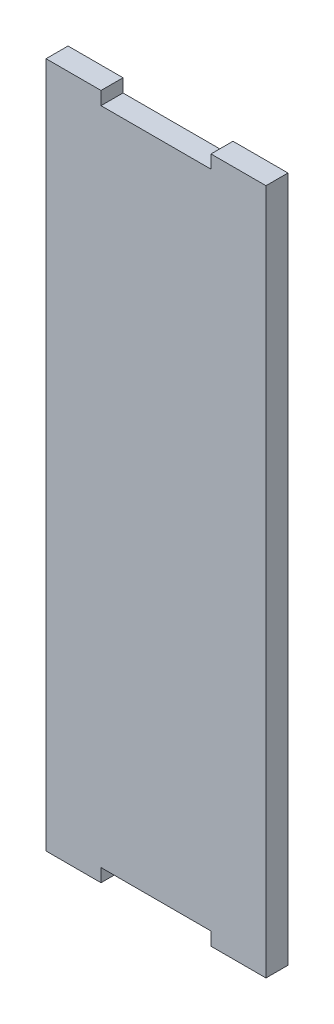
ISO-10303-21;
HEADER;
FILE_DESCRIPTION(('STEP AP214'),'2;1');
FILE_NAME('part.step','',(''),(''),'','','');
FILE_SCHEMA(('AUTOMOTIVE_DESIGN { 1 0 10303 214 1 1 1 1 }'));
ENDSEC;
DATA;
#1=APPLICATION_CONTEXT('core data for automotive mechanical design processes');
#2=APPLICATION_PROTOCOL_DEFINITION('international standard','automotive_design',2000,#1);
#3=PRODUCT_CONTEXT('',#1,'mechanical');
#4=PRODUCT('Part','Part','',(#3));
#5=PRODUCT_RELATED_PRODUCT_CATEGORY('part','',(#4));
#6=PRODUCT_DEFINITION_FORMATION('','',#4);
#7=PRODUCT_DEFINITION_CONTEXT('part definition',#1,'design');
#8=PRODUCT_DEFINITION('design','',#6,#7);
#9=PRODUCT_DEFINITION_SHAPE('','',#8);
#10=(LENGTH_UNIT() NAMED_UNIT(*) SI_UNIT(.MILLI.,.METRE.));
#11=(NAMED_UNIT(*) PLANE_ANGLE_UNIT() SI_UNIT($,.RADIAN.));
#12=(NAMED_UNIT(*) SI_UNIT($,.STERADIAN.) SOLID_ANGLE_UNIT());
#13=UNCERTAINTY_MEASURE_WITH_UNIT(LENGTH_MEASURE(1.E-05),#10,'distance_accuracy_value','');
#14=(GEOMETRIC_REPRESENTATION_CONTEXT(3) GLOBAL_UNCERTAINTY_ASSIGNED_CONTEXT((#13)) GLOBAL_UNIT_ASSIGNED_CONTEXT((#10,
#11,#12)) REPRESENTATION_CONTEXT('',''));
#15=CARTESIAN_POINT('',(0.,0.,0.));
#16=DIRECTION('',(0.,0.,1.));
#17=DIRECTION('',(1.,0.,0.));
#18=AXIS2_PLACEMENT_3D('',#15,#16,#17);
#19=CARTESIAN_POINT('',(-25.,78.,5.));
#20=DIRECTION('',(0.,-1.,0.));
#21=DIRECTION('',(0.,0.,-1.));
#22=AXIS2_PLACEMENT_3D('',#19,#20,#21);
#23=PLANE('',#22);
#24=DIRECTION('',(0.,0.,-1.));
#25=VECTOR('',#24,1.);
#26=CARTESIAN_POINT('',(12.5,78.,27.86));
#27=LINE('',#26,#25);
#28=CARTESIAN_POINT('',(12.5,78.,5.));
#29=VERTEX_POINT('',#28);
#30=CARTESIAN_POINT('',(12.5,78.,0.));
#31=VERTEX_POINT('',#30);
#32=EDGE_CURVE('E142',#29,#31,#27,.T.);
#33=ORIENTED_EDGE('',*,*,#32,.F.);
#34=DIRECTION('',(-1.,0.,0.));
#35=VECTOR('',#34,1.);
#36=CARTESIAN_POINT('',(-25.,78.,5.));
#37=LINE('',#36,#35);
#38=CARTESIAN_POINT('',(25.,78.,5.));
#39=VERTEX_POINT('',#38);
#40=EDGE_CURVE('E166',#39,#29,#37,.T.);
#41=ORIENTED_EDGE('',*,*,#40,.F.);
#42=DIRECTION('',(0.,0.,-1.));
#43=VECTOR('',#42,1.);
#44=CARTESIAN_POINT('',(25.,78.,5.));
#45=LINE('',#44,#43);
#46=CARTESIAN_POINT('',(25.,78.,0.));
#47=VERTEX_POINT('',#46);
#48=EDGE_CURVE('E193',#39,#47,#45,.T.);
#49=ORIENTED_EDGE('',*,*,#48,.T.);
#50=DIRECTION('',(-1.,0.,0.));
#51=VECTOR('',#50,1.);
#52=CARTESIAN_POINT('',(-25.,78.,0.));
#53=LINE('',#52,#51);
#54=EDGE_CURVE('E177',#47,#31,#53,.T.);
#55=ORIENTED_EDGE('',*,*,#54,.T.);
#56=EDGE_LOOP('',(#33,#41,#49,#55));
#57=FACE_BOUND('',#56,.T.);
#58=ADVANCED_FACE('F33',(#57),#23,.F.);
#59=DIRECTION('',(0.,0.,-1.));
#60=VECTOR('',#59,1.);
#61=CARTESIAN_POINT('',(-12.5,78.,27.86));
#62=LINE('',#61,#60);
#63=CARTESIAN_POINT('',(-12.5,78.,5.));
#64=VERTEX_POINT('',#63);
#65=CARTESIAN_POINT('',(-12.5,78.,0.));
#66=VERTEX_POINT('',#65);
#67=EDGE_CURVE('E144',#64,#66,#62,.T.);
#68=ORIENTED_EDGE('',*,*,#67,.T.);
#69=CARTESIAN_POINT('',(-25.,78.,0.));
#70=VERTEX_POINT('',#69);
#71=EDGE_CURVE('E176',#66,#70,#53,.T.);
#72=ORIENTED_EDGE('',*,*,#71,.T.);
#73=DIRECTION('',(0.,0.,-1.));
#74=VECTOR('',#73,1.);
#75=CARTESIAN_POINT('',(-25.,78.,5.));
#76=LINE('',#75,#74);
#77=CARTESIAN_POINT('',(-25.,78.,5.));
#78=VERTEX_POINT('',#77);
#79=EDGE_CURVE('E190',#78,#70,#76,.T.);
#80=ORIENTED_EDGE('',*,*,#79,.F.);
#81=EDGE_CURVE('E164',#64,#78,#37,.T.);
#82=ORIENTED_EDGE('',*,*,#81,.F.);
#83=EDGE_LOOP('',(#68,#72,#80,#82));
#84=FACE_BOUND('',#83,.T.);
#85=ADVANCED_FACE('F214',(#84),#23,.F.);
#86=CARTESIAN_POINT('',(-25.,-78.,5.));
#87=DIRECTION('',(0.,1.,0.));
#88=DIRECTION('',(0.,0.,1.));
#89=AXIS2_PLACEMENT_3D('',#86,#87,#88);
#90=PLANE('',#89);
#91=DIRECTION('',(0.,0.,-1.));
#92=VECTOR('',#91,1.);
#93=CARTESIAN_POINT('',(-12.5,-78.,27.86));
#94=LINE('',#93,#92);
#95=CARTESIAN_POINT('',(-12.5,-78.,5.));
#96=VERTEX_POINT('',#95);
#97=CARTESIAN_POINT('',(-12.5,-78.,0.));
#98=VERTEX_POINT('',#97);
#99=EDGE_CURVE('E147',#96,#98,#94,.T.);
#100=ORIENTED_EDGE('',*,*,#99,.F.);
#101=DIRECTION('',(1.,0.,0.));
#102=VECTOR('',#101,1.);
#103=CARTESIAN_POINT('',(-25.,-78.,5.));
#104=LINE('',#103,#102);
#105=CARTESIAN_POINT('',(-25.,-78.,5.));
#106=VERTEX_POINT('',#105);
#107=EDGE_CURVE('E171',#106,#96,#104,.T.);
#108=ORIENTED_EDGE('',*,*,#107,.F.);
#109=DIRECTION('',(0.,0.,-1.));
#110=VECTOR('',#109,1.);
#111=CARTESIAN_POINT('',(-25.,-78.,5.));
#112=LINE('',#111,#110);
#113=CARTESIAN_POINT('',(-25.,-78.,0.));
#114=VERTEX_POINT('',#113);
#115=EDGE_CURVE('E187',#106,#114,#112,.T.);
#116=ORIENTED_EDGE('',*,*,#115,.T.);
#117=DIRECTION('',(1.,0.,0.));
#118=VECTOR('',#117,1.);
#119=CARTESIAN_POINT('',(-25.,-78.,0.));
#120=LINE('',#119,#118);
#121=EDGE_CURVE('E165',#114,#98,#120,.T.);
#122=ORIENTED_EDGE('',*,*,#121,.T.);
#123=EDGE_LOOP('',(#100,#108,#116,#122));
#124=FACE_BOUND('',#123,.T.);
#125=ADVANCED_FACE('F229',(#124),#90,.F.);
#126=DIRECTION('',(0.,0.,-1.));
#127=VECTOR('',#126,1.);
#128=CARTESIAN_POINT('',(12.5,-78.,27.86));
#129=LINE('',#128,#127);
#130=CARTESIAN_POINT('',(12.5,-78.,5.));
#131=VERTEX_POINT('',#130);
#132=CARTESIAN_POINT('',(12.5,-78.,0.));
#133=VERTEX_POINT('',#132);
#134=EDGE_CURVE('E127',#131,#133,#129,.T.);
#135=ORIENTED_EDGE('',*,*,#134,.T.);
#136=CARTESIAN_POINT('',(25.,-78.,0.));
#137=VERTEX_POINT('',#136);
#138=EDGE_CURVE('E182',#133,#137,#120,.T.);
#139=ORIENTED_EDGE('',*,*,#138,.T.);
#140=DIRECTION('',(0.,0.,-1.));
#141=VECTOR('',#140,1.);
#142=CARTESIAN_POINT('',(25.,-78.,5.));
#143=LINE('',#142,#141);
#144=CARTESIAN_POINT('',(25.,-78.,5.));
#145=VERTEX_POINT('',#144);
#146=EDGE_CURVE('E173',#145,#137,#143,.T.);
#147=ORIENTED_EDGE('',*,*,#146,.F.);
#148=EDGE_CURVE('E170',#131,#145,#104,.T.);
#149=ORIENTED_EDGE('',*,*,#148,.F.);
#150=EDGE_LOOP('',(#135,#139,#147,#149));
#151=FACE_BOUND('',#150,.T.);
#152=ADVANCED_FACE('F240',(#151),#90,.F.);
#153=CARTESIAN_POINT('',(0.,0.,5.));
#154=DIRECTION('',(0.,0.,1.));
#155=DIRECTION('',(1.,0.,0.));
#156=AXIS2_PLACEMENT_3D('',#153,#154,#155);
#157=PLANE('',#156);
#158=ORIENTED_EDGE('',*,*,#40,.T.);
#159=DIRECTION('',(0.,-1.,0.));
#160=VECTOR('',#159,1.);
#161=CARTESIAN_POINT('',(12.4999999999999,0.,5.));
#162=LINE('',#161,#160);
#163=CARTESIAN_POINT('',(12.5,75.,5.));
#164=VERTEX_POINT('',#163);
#165=EDGE_CURVE('E157',#29,#164,#162,.T.);
#166=ORIENTED_EDGE('',*,*,#165,.T.);
#167=DIRECTION('',(-1.,0.,0.));
#168=VECTOR('',#167,1.);
#169=CARTESIAN_POINT('',(0.,75.,5.));
#170=LINE('',#169,#168);
#171=CARTESIAN_POINT('',(-12.5,75.,5.));
#172=VERTEX_POINT('',#171);
#173=EDGE_CURVE('E151',#164,#172,#170,.T.);
#174=ORIENTED_EDGE('',*,*,#173,.T.);
#175=DIRECTION('',(0.,1.,0.));
#176=VECTOR('',#175,1.);
#177=CARTESIAN_POINT('',(-12.4999999999999,0.,5.));
#178=LINE('',#177,#176);
#179=EDGE_CURVE('E154',#172,#64,#178,.T.);
#180=ORIENTED_EDGE('',*,*,#179,.T.);
#181=ORIENTED_EDGE('',*,*,#81,.T.);
#182=DIRECTION('',(0.,-1.,0.));
#183=VECTOR('',#182,1.);
#184=CARTESIAN_POINT('',(-25.,78.,5.));
#185=LINE('',#184,#183);
#186=EDGE_CURVE('E168',#78,#106,#185,.T.);
#187=ORIENTED_EDGE('',*,*,#186,.T.);
#188=ORIENTED_EDGE('',*,*,#107,.T.);
#189=DIRECTION('',(0.,1.,0.));
#190=VECTOR('',#189,1.);
#191=CARTESIAN_POINT('',(-12.4999999999999,0.,5.));
#192=LINE('',#191,#190);
#193=CARTESIAN_POINT('',(-12.5,-75.,5.));
#194=VERTEX_POINT('',#193);
#195=EDGE_CURVE('E131',#96,#194,#192,.T.);
#196=ORIENTED_EDGE('',*,*,#195,.T.);
#197=DIRECTION('',(1.,0.,0.));
#198=VECTOR('',#197,1.);
#199=CARTESIAN_POINT('',(0.,-75.,5.));
#200=LINE('',#199,#198);
#201=CARTESIAN_POINT('',(12.5,-75.,5.));
#202=VERTEX_POINT('',#201);
#203=EDGE_CURVE('E132',#194,#202,#200,.T.);
#204=ORIENTED_EDGE('',*,*,#203,.T.);
#205=DIRECTION('',(0.,-1.,0.));
#206=VECTOR('',#205,1.);
#207=CARTESIAN_POINT('',(12.4999999999998,0.,5.));
#208=LINE('',#207,#206);
#209=EDGE_CURVE('E121',#202,#131,#208,.T.);
#210=ORIENTED_EDGE('',*,*,#209,.T.);
#211=ORIENTED_EDGE('',*,*,#148,.T.);
#212=DIRECTION('',(0.,1.,0.));
#213=VECTOR('',#212,1.);
#214=CARTESIAN_POINT('',(25.,78.,5.));
#215=LINE('',#214,#213);
#216=EDGE_CURVE('E161',#145,#39,#215,.T.);
#217=ORIENTED_EDGE('',*,*,#216,.T.);
#218=EDGE_LOOP('',(#158,#166,#174,#180,#181,#187,#188,#196,#204,#210,#211,#217));
#219=FACE_BOUND('',#218,.T.);
#220=ADVANCED_FACE('F140',(#219),#157,.T.);
#221=CARTESIAN_POINT('',(0.,0.,0.));
#222=DIRECTION('',(0.,0.,1.));
#223=DIRECTION('',(1.,0.,0.));
#224=AXIS2_PLACEMENT_3D('',#221,#222,#223);
#225=PLANE('',#224);
#226=DIRECTION('',(0.,-1.,0.));
#227=VECTOR('',#226,1.);
#228=CARTESIAN_POINT('',(12.4999999999999,0.,0.));
#229=LINE('',#228,#227);
#230=CARTESIAN_POINT('',(12.5,75.,0.));
#231=VERTEX_POINT('',#230);
#232=EDGE_CURVE('E11',#31,#231,#229,.T.);
#233=ORIENTED_EDGE('',*,*,#232,.F.);
#234=ORIENTED_EDGE('',*,*,#54,.F.);
#235=DIRECTION('',(0.,1.,0.));
#236=VECTOR('',#235,1.);
#237=CARTESIAN_POINT('',(25.,78.,0.));
#238=LINE('',#237,#236);
#239=EDGE_CURVE('E160',#137,#47,#238,.T.);
#240=ORIENTED_EDGE('',*,*,#239,.F.);
#241=ORIENTED_EDGE('',*,*,#138,.F.);
#242=DIRECTION('',(0.,-1.,0.));
#243=VECTOR('',#242,1.);
#244=CARTESIAN_POINT('',(12.4999999999998,0.,0.));
#245=LINE('',#244,#243);
#246=CARTESIAN_POINT('',(12.5,-75.,0.));
#247=VERTEX_POINT('',#246);
#248=EDGE_CURVE('E197',#247,#133,#245,.T.);
#249=ORIENTED_EDGE('',*,*,#248,.F.);
#250=DIRECTION('',(1.,0.,0.));
#251=VECTOR('',#250,1.);
#252=CARTESIAN_POINT('',(0.,-75.,0.));
#253=LINE('',#252,#251);
#254=CARTESIAN_POINT('',(-12.5,-75.,0.));
#255=VERTEX_POINT('',#254);
#256=EDGE_CURVE('E136',#255,#247,#253,.T.);
#257=ORIENTED_EDGE('',*,*,#256,.F.);
#258=DIRECTION('',(0.,1.,0.));
#259=VECTOR('',#258,1.);
#260=CARTESIAN_POINT('',(-12.4999999999999,0.,0.));
#261=LINE('',#260,#259);
#262=EDGE_CURVE('E199',#98,#255,#261,.T.);
#263=ORIENTED_EDGE('',*,*,#262,.F.);
#264=ORIENTED_EDGE('',*,*,#121,.F.);
#265=DIRECTION('',(0.,-1.,0.));
#266=VECTOR('',#265,1.);
#267=CARTESIAN_POINT('',(-25.,78.,0.));
#268=LINE('',#267,#266);
#269=EDGE_CURVE('E180',#70,#114,#268,.T.);
#270=ORIENTED_EDGE('',*,*,#269,.F.);
#271=ORIENTED_EDGE('',*,*,#71,.F.);
#272=DIRECTION('',(0.,1.,0.));
#273=VECTOR('',#272,1.);
#274=CARTESIAN_POINT('',(-12.4999999999999,0.,0.));
#275=LINE('',#274,#273);
#276=CARTESIAN_POINT('',(-12.5,75.,0.));
#277=VERTEX_POINT('',#276);
#278=EDGE_CURVE('E41',#277,#66,#275,.T.);
#279=ORIENTED_EDGE('',*,*,#278,.F.);
#280=DIRECTION('',(-1.,0.,0.));
#281=VECTOR('',#280,1.);
#282=CARTESIAN_POINT('',(0.,75.,0.));
#283=LINE('',#282,#281);
#284=EDGE_CURVE('E201',#231,#277,#283,.T.);
#285=ORIENTED_EDGE('',*,*,#284,.F.);
#286=EDGE_LOOP('',(#233,#234,#240,#241,#249,#257,#263,#264,#270,#271,#279,#285));
#287=FACE_BOUND('',#286,.T.);
#288=ADVANCED_FACE('F219',(#287),#225,.F.);
#289=CARTESIAN_POINT('',(25.,78.,5.));
#290=DIRECTION('',(-1.,0.,0.));
#291=DIRECTION('',(0.,-1.,0.));
#292=AXIS2_PLACEMENT_3D('',#289,#290,#291);
#293=PLANE('',#292);
#294=ORIENTED_EDGE('',*,*,#239,.T.);
#295=ORIENTED_EDGE('',*,*,#48,.F.);
#296=ORIENTED_EDGE('',*,*,#216,.F.);
#297=ORIENTED_EDGE('',*,*,#146,.T.);
#298=EDGE_LOOP('',(#294,#295,#296,#297));
#299=FACE_BOUND('',#298,.T.);
#300=ADVANCED_FACE('F35',(#299),#293,.F.);
#301=CARTESIAN_POINT('',(-25.,78.,5.));
#302=DIRECTION('',(1.,0.,0.));
#303=DIRECTION('',(0.,1.,0.));
#304=AXIS2_PLACEMENT_3D('',#301,#302,#303);
#305=PLANE('',#304);
#306=ORIENTED_EDGE('',*,*,#269,.T.);
#307=ORIENTED_EDGE('',*,*,#115,.F.);
#308=ORIENTED_EDGE('',*,*,#186,.F.);
#309=ORIENTED_EDGE('',*,*,#79,.T.);
#310=EDGE_LOOP('',(#306,#307,#308,#309));
#311=FACE_BOUND('',#310,.T.);
#312=ADVANCED_FACE('F224',(#311),#305,.F.);
#313=CARTESIAN_POINT('',(-12.5,-78.,27.86));
#314=DIRECTION('',(1.,0.,0.));
#315=DIRECTION('',(0.,1.,0.));
#316=AXIS2_PLACEMENT_3D('',#313,#314,#315);
#317=PLANE('',#316);
#318=ORIENTED_EDGE('',*,*,#99,.T.);
#319=ORIENTED_EDGE('',*,*,#262,.T.);
#320=DIRECTION('',(0.,0.,-1.));
#321=VECTOR('',#320,1.);
#322=CARTESIAN_POINT('',(-12.5,-75.,27.86));
#323=LINE('',#322,#321);
#324=EDGE_CURVE('E55',#194,#255,#323,.T.);
#325=ORIENTED_EDGE('',*,*,#324,.F.);
#326=ORIENTED_EDGE('',*,*,#195,.F.);
#327=EDGE_LOOP('',(#318,#319,#325,#326));
#328=FACE_BOUND('',#327,.T.);
#329=ADVANCED_FACE('F237',(#328),#317,.T.);
#330=CARTESIAN_POINT('',(12.5,-78.,27.86));
#331=DIRECTION('',(-1.,0.,0.));
#332=DIRECTION('',(0.,-1.,0.));
#333=AXIS2_PLACEMENT_3D('',#330,#331,#332);
#334=PLANE('',#333);
#335=DIRECTION('',(0.,0.,-1.));
#336=VECTOR('',#335,1.);
#337=CARTESIAN_POINT('',(12.5,-75.,27.86));
#338=LINE('',#337,#336);
#339=EDGE_CURVE('E124',#202,#247,#338,.T.);
#340=ORIENTED_EDGE('',*,*,#339,.T.);
#341=ORIENTED_EDGE('',*,*,#248,.T.);
#342=ORIENTED_EDGE('',*,*,#134,.F.);
#343=ORIENTED_EDGE('',*,*,#209,.F.);
#344=EDGE_LOOP('',(#340,#341,#342,#343));
#345=FACE_BOUND('',#344,.T.);
#346=ADVANCED_FACE('F123',(#345),#334,.T.);
#347=CARTESIAN_POINT('',(-12.5,-75.,27.86));
#348=DIRECTION('',(0.,-1.,0.));
#349=DIRECTION('',(0.,0.,-1.));
#350=AXIS2_PLACEMENT_3D('',#347,#348,#349);
#351=PLANE('',#350);
#352=ORIENTED_EDGE('',*,*,#324,.T.);
#353=ORIENTED_EDGE('',*,*,#256,.T.);
#354=ORIENTED_EDGE('',*,*,#339,.F.);
#355=ORIENTED_EDGE('',*,*,#203,.F.);
#356=EDGE_LOOP('',(#352,#353,#354,#355));
#357=FACE_BOUND('',#356,.T.);
#358=ADVANCED_FACE('F134',(#357),#351,.T.);
#359=CARTESIAN_POINT('',(12.5,78.,27.86));
#360=DIRECTION('',(-1.,0.,0.));
#361=DIRECTION('',(0.,-1.,0.));
#362=AXIS2_PLACEMENT_3D('',#359,#360,#361);
#363=PLANE('',#362);
#364=ORIENTED_EDGE('',*,*,#32,.T.);
#365=ORIENTED_EDGE('',*,*,#232,.T.);
#366=DIRECTION('',(0.,0.,-1.));
#367=VECTOR('',#366,1.);
#368=CARTESIAN_POINT('',(12.5,75.,27.86));
#369=LINE('',#368,#367);
#370=EDGE_CURVE('E48',#164,#231,#369,.T.);
#371=ORIENTED_EDGE('',*,*,#370,.F.);
#372=ORIENTED_EDGE('',*,*,#165,.F.);
#373=EDGE_LOOP('',(#364,#365,#371,#372));
#374=FACE_BOUND('',#373,.T.);
#375=ADVANCED_FACE('F247',(#374),#363,.T.);
#376=CARTESIAN_POINT('',(-12.5,78.,27.86));
#377=DIRECTION('',(1.,0.,0.));
#378=DIRECTION('',(0.,1.,0.));
#379=AXIS2_PLACEMENT_3D('',#376,#377,#378);
#380=PLANE('',#379);
#381=DIRECTION('',(0.,0.,-1.));
#382=VECTOR('',#381,1.);
#383=CARTESIAN_POINT('',(-12.5,75.,27.86));
#384=LINE('',#383,#382);
#385=EDGE_CURVE('E208',#172,#277,#384,.T.);
#386=ORIENTED_EDGE('',*,*,#385,.T.);
#387=ORIENTED_EDGE('',*,*,#278,.T.);
#388=ORIENTED_EDGE('',*,*,#67,.F.);
#389=ORIENTED_EDGE('',*,*,#179,.F.);
#390=EDGE_LOOP('',(#386,#387,#388,#389));
#391=FACE_BOUND('',#390,.T.);
#392=ADVANCED_FACE('F206',(#391),#380,.T.);
#393=CARTESIAN_POINT('',(-12.5,75.,27.86));
#394=DIRECTION('',(0.,1.,0.));
#395=DIRECTION('',(-1.,0.,0.));
#396=AXIS2_PLACEMENT_3D('',#393,#394,#395);
#397=PLANE('',#396);
#398=ORIENTED_EDGE('',*,*,#370,.T.);
#399=ORIENTED_EDGE('',*,*,#284,.T.);
#400=ORIENTED_EDGE('',*,*,#385,.F.);
#401=ORIENTED_EDGE('',*,*,#173,.F.);
#402=EDGE_LOOP('',(#398,#399,#400,#401));
#403=FACE_BOUND('',#402,.T.);
#404=ADVANCED_FACE('F230',(#403),#397,.T.);
#405=CLOSED_SHELL('',(#58,#85,#125,#152,#220,#288,#300,#312,#329,#346,#358,#375,#392,#404));
#406=MANIFOLD_SOLID_BREP('B2',#405);
#407=ADVANCED_BREP_SHAPE_REPRESENTATION('',(#18,#406),#14);
#408=SHAPE_DEFINITION_REPRESENTATION(#9,#407);
ENDSEC;
END-ISO-10303-21;
